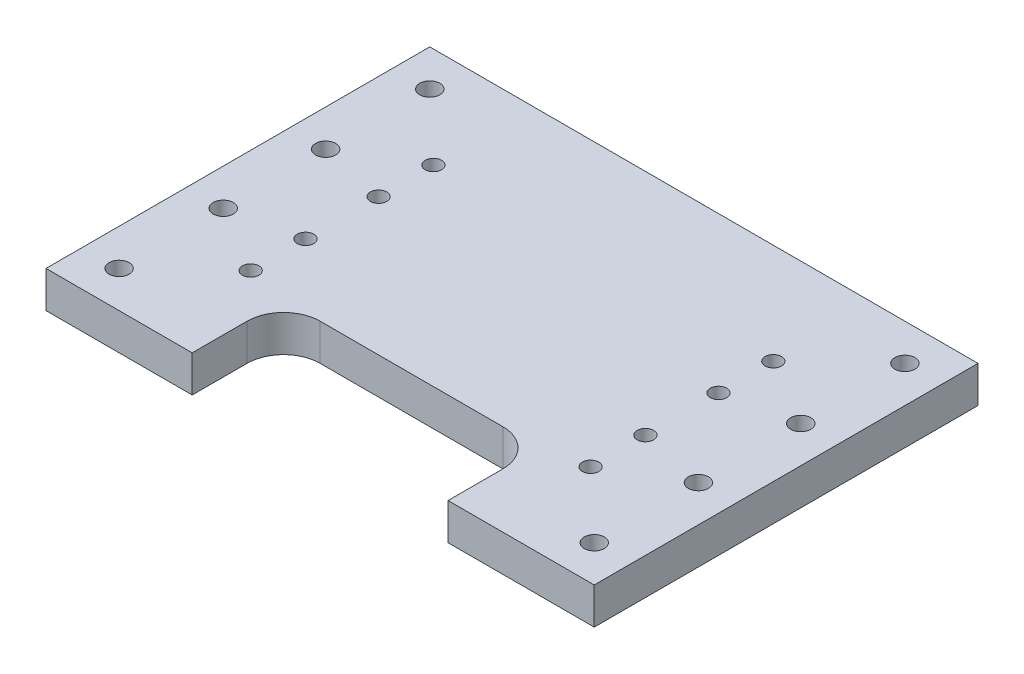
ISO-10303-21;
HEADER;
FILE_DESCRIPTION(('STEP AP214'),'2;1');
FILE_NAME('part.step','',(''),(''),'','','');
FILE_SCHEMA(('AUTOMOTIVE_DESIGN { 1 0 10303 214 1 1 1 1 }'));
ENDSEC;
DATA;
#1=APPLICATION_CONTEXT('core data for automotive mechanical design processes');
#2=APPLICATION_PROTOCOL_DEFINITION('international standard','automotive_design',2000,#1);
#3=PRODUCT_CONTEXT('',#1,'mechanical');
#4=PRODUCT('Part','Part','',(#3));
#5=PRODUCT_RELATED_PRODUCT_CATEGORY('part','',(#4));
#6=PRODUCT_DEFINITION_FORMATION('','',#4);
#7=PRODUCT_DEFINITION_CONTEXT('part definition',#1,'design');
#8=PRODUCT_DEFINITION('design','',#6,#7);
#9=PRODUCT_DEFINITION_SHAPE('','',#8);
#10=(LENGTH_UNIT() NAMED_UNIT(*) SI_UNIT(.MILLI.,.METRE.));
#11=(NAMED_UNIT(*) PLANE_ANGLE_UNIT() SI_UNIT($,.RADIAN.));
#12=(NAMED_UNIT(*) SI_UNIT($,.STERADIAN.) SOLID_ANGLE_UNIT());
#13=UNCERTAINTY_MEASURE_WITH_UNIT(LENGTH_MEASURE(1.E-05),#10,'distance_accuracy_value','');
#14=(GEOMETRIC_REPRESENTATION_CONTEXT(3) GLOBAL_UNCERTAINTY_ASSIGNED_CONTEXT((#13)) GLOBAL_UNIT_ASSIGNED_CONTEXT((#10,
#11,#12)) REPRESENTATION_CONTEXT('',''));
#15=CARTESIAN_POINT('',(0.,0.,0.));
#16=DIRECTION('',(0.,0.,1.));
#17=DIRECTION('',(1.,0.,0.));
#18=AXIS2_PLACEMENT_3D('',#15,#16,#17);
#19=CARTESIAN_POINT('',(75.,5.,52.5));
#20=DIRECTION('',(0.,0.,-1.));
#21=DIRECTION('',(-1.,0.,0.));
#22=AXIS2_PLACEMENT_3D('',#19,#20,#21);
#23=PLANE('',#22);
#24=DIRECTION('',(1.,0.,0.));
#25=VECTOR('',#24,1.);
#26=CARTESIAN_POINT('',(75.,-5.,52.5));
#27=LINE('',#26,#25);
#28=CARTESIAN_POINT('',(-75.,-5.,52.5));
#29=VERTEX_POINT('',#28);
#30=CARTESIAN_POINT('',(-35.,-5.,52.5));
#31=VERTEX_POINT('',#30);
#32=EDGE_CURVE('E142',#29,#31,#27,.T.);
#33=ORIENTED_EDGE('',*,*,#32,.T.);
#34=DIRECTION('',(0.,1.,0.));
#35=VECTOR('',#34,1.);
#36=CARTESIAN_POINT('',(-35.,-5.,52.5));
#37=LINE('',#36,#35);
#38=CARTESIAN_POINT('',(-35.,5.,52.5));
#39=VERTEX_POINT('',#38);
#40=EDGE_CURVE('E153',#31,#39,#37,.T.);
#41=ORIENTED_EDGE('',*,*,#40,.T.);
#42=DIRECTION('',(1.,0.,0.));
#43=VECTOR('',#42,1.);
#44=CARTESIAN_POINT('',(75.,5.,52.5));
#45=LINE('',#44,#43);
#46=CARTESIAN_POINT('',(-75.,5.,52.5));
#47=VERTEX_POINT('',#46);
#48=EDGE_CURVE('E184',#47,#39,#45,.T.);
#49=ORIENTED_EDGE('',*,*,#48,.F.);
#50=DIRECTION('',(0.,-1.,0.));
#51=VECTOR('',#50,1.);
#52=CARTESIAN_POINT('',(-75.,5.,52.5));
#53=LINE('',#52,#51);
#54=EDGE_CURVE('E166',#47,#29,#53,.T.);
#55=ORIENTED_EDGE('',*,*,#54,.T.);
#56=EDGE_LOOP('',(#33,#41,#49,#55));
#57=FACE_BOUND('',#56,.T.);
#58=ADVANCED_FACE('F45',(#57),#23,.F.);
#59=CARTESIAN_POINT('',(75.,5.,-52.5));
#60=DIRECTION('',(-1.,0.,0.));
#61=DIRECTION('',(0.,0.,1.));
#62=AXIS2_PLACEMENT_3D('',#59,#60,#61);
#63=PLANE('',#62);
#64=DIRECTION('',(0.,0.,-1.));
#65=VECTOR('',#64,1.);
#66=CARTESIAN_POINT('',(75.,-5.,-52.5));
#67=LINE('',#66,#65);
#68=CARTESIAN_POINT('',(75.,-5.,52.5));
#69=VERTEX_POINT('',#68);
#70=CARTESIAN_POINT('',(75.,-5.,-52.5));
#71=VERTEX_POINT('',#70);
#72=EDGE_CURVE('E217',#69,#71,#67,.T.);
#73=ORIENTED_EDGE('',*,*,#72,.T.);
#74=DIRECTION('',(0.,-1.,0.));
#75=VECTOR('',#74,1.);
#76=CARTESIAN_POINT('',(75.,5.,-52.5));
#77=LINE('',#76,#75);
#78=CARTESIAN_POINT('',(75.,5.,-52.5));
#79=VERTEX_POINT('',#78);
#80=EDGE_CURVE('E189',#79,#71,#77,.T.);
#81=ORIENTED_EDGE('',*,*,#80,.F.);
#82=DIRECTION('',(0.,0.,-1.));
#83=VECTOR('',#82,1.);
#84=CARTESIAN_POINT('',(75.,5.,-52.5));
#85=LINE('',#84,#83);
#86=CARTESIAN_POINT('',(75.,5.,52.5));
#87=VERTEX_POINT('',#86);
#88=EDGE_CURVE('E168',#87,#79,#85,.T.);
#89=ORIENTED_EDGE('',*,*,#88,.F.);
#90=DIRECTION('',(0.,-1.,0.));
#91=VECTOR('',#90,1.);
#92=CARTESIAN_POINT('',(75.,5.,52.5));
#93=LINE('',#92,#91);
#94=EDGE_CURVE('E180',#87,#69,#93,.T.);
#95=ORIENTED_EDGE('',*,*,#94,.T.);
#96=EDGE_LOOP('',(#73,#81,#89,#95));
#97=FACE_BOUND('',#96,.T.);
#98=ADVANCED_FACE('F413',(#97),#63,.F.);
#99=CARTESIAN_POINT('',(75.,5.,-52.5));
#100=DIRECTION('',(0.,0.,1.));
#101=DIRECTION('',(1.,0.,0.));
#102=AXIS2_PLACEMENT_3D('',#99,#100,#101);
#103=PLANE('',#102);
#104=DIRECTION('',(-1.,0.,0.));
#105=VECTOR('',#104,1.);
#106=CARTESIAN_POINT('',(75.,-5.,-52.5));
#107=LINE('',#106,#105);
#108=CARTESIAN_POINT('',(-75.,-5.,-52.5));
#109=VERTEX_POINT('',#108);
#110=EDGE_CURVE('E219',#71,#109,#107,.T.);
#111=ORIENTED_EDGE('',*,*,#110,.T.);
#112=DIRECTION('',(0.,-1.,0.));
#113=VECTOR('',#112,1.);
#114=CARTESIAN_POINT('',(-75.,5.,-52.5));
#115=LINE('',#114,#113);
#116=CARTESIAN_POINT('',(-75.,5.,-52.5));
#117=VERTEX_POINT('',#116);
#118=EDGE_CURVE('E186',#117,#109,#115,.T.);
#119=ORIENTED_EDGE('',*,*,#118,.F.);
#120=DIRECTION('',(-1.,0.,0.));
#121=VECTOR('',#120,1.);
#122=CARTESIAN_POINT('',(75.,5.,-52.5));
#123=LINE('',#122,#121);
#124=EDGE_CURVE('E173',#79,#117,#123,.T.);
#125=ORIENTED_EDGE('',*,*,#124,.F.);
#126=ORIENTED_EDGE('',*,*,#80,.T.);
#127=EDGE_LOOP('',(#111,#119,#125,#126));
#128=FACE_BOUND('',#127,.T.);
#129=ADVANCED_FACE('F421',(#128),#103,.F.);
#130=CARTESIAN_POINT('',(-75.,5.,-52.5));
#131=DIRECTION('',(1.,0.,0.));
#132=DIRECTION('',(0.,0.,-1.));
#133=AXIS2_PLACEMENT_3D('',#130,#131,#132);
#134=PLANE('',#133);
#135=DIRECTION('',(0.,0.,1.));
#136=VECTOR('',#135,1.);
#137=CARTESIAN_POINT('',(-75.,-5.,-52.5));
#138=LINE('',#137,#136);
#139=EDGE_CURVE('E176',#109,#29,#138,.T.);
#140=ORIENTED_EDGE('',*,*,#139,.T.);
#141=ORIENTED_EDGE('',*,*,#54,.F.);
#142=DIRECTION('',(0.,0.,1.));
#143=VECTOR('',#142,1.);
#144=CARTESIAN_POINT('',(-75.,5.,-52.5));
#145=LINE('',#144,#143);
#146=EDGE_CURVE('E258',#117,#47,#145,.T.);
#147=ORIENTED_EDGE('',*,*,#146,.F.);
#148=ORIENTED_EDGE('',*,*,#118,.T.);
#149=EDGE_LOOP('',(#140,#141,#147,#148));
#150=FACE_BOUND('',#149,.T.);
#151=ADVANCED_FACE('F425',(#150),#134,.F.);
#152=CARTESIAN_POINT('',(35.,5.,52.5));
#153=VERTEX_POINT('',#152);
#154=EDGE_CURVE('E257',#153,#87,#45,.T.);
#155=ORIENTED_EDGE('',*,*,#154,.F.);
#156=DIRECTION('',(0.,1.,0.));
#157=VECTOR('',#156,1.);
#158=CARTESIAN_POINT('',(35.,-5.,52.5));
#159=LINE('',#158,#157);
#160=CARTESIAN_POINT('',(35.,-5.,52.5));
#161=VERTEX_POINT('',#160);
#162=EDGE_CURVE('E161',#161,#153,#159,.T.);
#163=ORIENTED_EDGE('',*,*,#162,.F.);
#164=EDGE_CURVE('E169',#161,#69,#27,.T.);
#165=ORIENTED_EDGE('',*,*,#164,.T.);
#166=ORIENTED_EDGE('',*,*,#94,.F.);
#167=EDGE_LOOP('',(#155,#163,#165,#166));
#168=FACE_BOUND('',#167,.T.);
#169=ADVANCED_FACE('F415',(#168),#23,.F.);
#170=CARTESIAN_POINT('',(0.,5.,0.));
#171=DIRECTION('',(0.,-1.,0.));
#172=DIRECTION('',(0.,0.,-1.));
#173=AXIS2_PLACEMENT_3D('',#170,#171,#172);
#174=PLANE('',#173);
#175=CARTESIAN_POINT('',(65.0000000000001,5.,42.5));
#176=DIRECTION('',(0.,1.,0.));
#177=DIRECTION('',(0.,0.,1.));
#178=AXIS2_PLACEMENT_3D('',#175,#176,#177);
#179=CIRCLE('',#178,2.75);
#180=CARTESIAN_POINT('',(65.0000000000001,5.,45.25));
#181=VERTEX_POINT('',#180);
#182=EDGE_CURVE('E375',#181,#181,#179,.T.);
#183=ORIENTED_EDGE('',*,*,#182,.F.);
#184=EDGE_LOOP('',(#183));
#185=FACE_BOUND('',#184,.T.);
#186=CARTESIAN_POINT('',(65.,5.,-42.5));
#187=DIRECTION('',(0.,1.,0.));
#188=DIRECTION('',(0.,0.,1.));
#189=AXIS2_PLACEMENT_3D('',#186,#187,#188);
#190=CIRCLE('',#189,2.75);
#191=CARTESIAN_POINT('',(65.,5.,-39.75));
#192=VERTEX_POINT('',#191);
#193=EDGE_CURVE('E368',#192,#192,#190,.T.);
#194=ORIENTED_EDGE('',*,*,#193,.F.);
#195=EDGE_LOOP('',(#194));
#196=FACE_BOUND('',#195,.T.);
#197=CARTESIAN_POINT('',(-65.,5.,-42.5));
#198=DIRECTION('',(0.,1.,0.));
#199=DIRECTION('',(0.,0.,1.));
#200=AXIS2_PLACEMENT_3D('',#197,#198,#199);
#201=CIRCLE('',#200,2.75);
#202=CARTESIAN_POINT('',(-65.,5.,-39.75));
#203=VERTEX_POINT('',#202);
#204=EDGE_CURVE('E362',#203,#203,#201,.T.);
#205=ORIENTED_EDGE('',*,*,#204,.F.);
#206=EDGE_LOOP('',(#205));
#207=FACE_BOUND('',#206,.T.);
#208=CARTESIAN_POINT('',(-65.,5.,42.5));
#209=DIRECTION('',(0.,1.,0.));
#210=DIRECTION('',(0.,0.,1.));
#211=AXIS2_PLACEMENT_3D('',#208,#209,#210);
#212=CIRCLE('',#211,2.75);
#213=CARTESIAN_POINT('',(-65.,5.,45.25));
#214=VERTEX_POINT('',#213);
#215=EDGE_CURVE('E356',#214,#214,#212,.T.);
#216=ORIENTED_EDGE('',*,*,#215,.F.);
#217=EDGE_LOOP('',(#216));
#218=FACE_BOUND('',#217,.T.);
#219=CARTESIAN_POINT('',(-65.,5.,14.));
#220=DIRECTION('',(0.,1.,0.));
#221=DIRECTION('',(0.,0.,1.));
#222=AXIS2_PLACEMENT_3D('',#219,#220,#221);
#223=CIRCLE('',#222,2.75);
#224=CARTESIAN_POINT('',(-65.,5.,16.75));
#225=VERTEX_POINT('',#224);
#226=EDGE_CURVE('E350',#225,#225,#223,.T.);
#227=ORIENTED_EDGE('',*,*,#226,.F.);
#228=EDGE_LOOP('',(#227));
#229=FACE_BOUND('',#228,.T.);
#230=CARTESIAN_POINT('',(65.,5.,14.));
#231=DIRECTION('',(0.,1.,0.));
#232=DIRECTION('',(0.,0.,1.));
#233=AXIS2_PLACEMENT_3D('',#230,#231,#232);
#234=CIRCLE('',#233,2.75);
#235=CARTESIAN_POINT('',(65.,5.,16.75));
#236=VERTEX_POINT('',#235);
#237=EDGE_CURVE('E240',#236,#236,#234,.T.);
#238=ORIENTED_EDGE('',*,*,#237,.F.);
#239=EDGE_LOOP('',(#238));
#240=FACE_BOUND('',#239,.T.);
#241=CARTESIAN_POINT('',(-65.,5.,-14.));
#242=DIRECTION('',(0.,1.,0.));
#243=DIRECTION('',(0.,0.,1.));
#244=AXIS2_PLACEMENT_3D('',#241,#242,#243);
#245=CIRCLE('',#244,2.75);
#246=CARTESIAN_POINT('',(-65.,5.,-11.25));
#247=VERTEX_POINT('',#246);
#248=EDGE_CURVE('E343',#247,#247,#245,.T.);
#249=ORIENTED_EDGE('',*,*,#248,.F.);
#250=EDGE_LOOP('',(#249));
#251=FACE_BOUND('',#250,.T.);
#252=CARTESIAN_POINT('',(65.,5.,-14.));
#253=DIRECTION('',(0.,1.,0.));
#254=DIRECTION('',(0.,0.,1.));
#255=AXIS2_PLACEMENT_3D('',#252,#253,#254);
#256=CIRCLE('',#255,2.75);
#257=CARTESIAN_POINT('',(65.,5.,-11.25));
#258=VERTEX_POINT('',#257);
#259=EDGE_CURVE('E337',#258,#258,#256,.T.);
#260=ORIENTED_EDGE('',*,*,#259,.F.);
#261=EDGE_LOOP('',(#260));
#262=FACE_BOUND('',#261,.T.);
#263=CARTESIAN_POINT('',(46.5,4.99999999999999,25.));
#264=DIRECTION('',(0.,-1.,0.));
#265=DIRECTION('',(0.,0.,-1.));
#266=AXIS2_PLACEMENT_3D('',#263,#264,#265);
#267=CIRCLE('',#266,2.25000000000001);
#268=CARTESIAN_POINT('',(46.5,4.99999999999999,22.75));
#269=VERTEX_POINT('',#268);
#270=EDGE_CURVE('E211',#269,#269,#267,.T.);
#271=ORIENTED_EDGE('',*,*,#270,.T.);
#272=EDGE_LOOP('',(#271));
#273=FACE_BOUND('',#272,.T.);
#274=CARTESIAN_POINT('',(46.5,4.99999999999999,9.99999999999999));
#275=DIRECTION('',(0.,-1.,0.));
#276=DIRECTION('',(0.,0.,-1.));
#277=AXIS2_PLACEMENT_3D('',#274,#275,#276);
#278=CIRCLE('',#277,2.25000000000001);
#279=CARTESIAN_POINT('',(46.5,4.99999999999999,7.74999999999999));
#280=VERTEX_POINT('',#279);
#281=EDGE_CURVE('E246',#280,#280,#278,.T.);
#282=ORIENTED_EDGE('',*,*,#281,.T.);
#283=EDGE_LOOP('',(#282));
#284=FACE_BOUND('',#283,.T.);
#285=CARTESIAN_POINT('',(46.5,4.99999999999999,-10.));
#286=DIRECTION('',(0.,-1.,0.));
#287=DIRECTION('',(0.,0.,-1.));
#288=AXIS2_PLACEMENT_3D('',#285,#286,#287);
#289=CIRCLE('',#288,2.25000000000001);
#290=CARTESIAN_POINT('',(46.5,4.99999999999999,-12.25));
#291=VERTEX_POINT('',#290);
#292=EDGE_CURVE('E320',#291,#291,#289,.T.);
#293=ORIENTED_EDGE('',*,*,#292,.T.);
#294=EDGE_LOOP('',(#293));
#295=FACE_BOUND('',#294,.T.);
#296=CARTESIAN_POINT('',(46.5,4.99999999999999,-25.));
#297=DIRECTION('',(0.,-1.,0.));
#298=DIRECTION('',(0.,0.,-1.));
#299=AXIS2_PLACEMENT_3D('',#296,#297,#298);
#300=CIRCLE('',#299,2.25000000000001);
#301=CARTESIAN_POINT('',(46.5,4.99999999999999,-27.25));
#302=VERTEX_POINT('',#301);
#303=EDGE_CURVE('E308',#302,#302,#300,.T.);
#304=ORIENTED_EDGE('',*,*,#303,.T.);
#305=EDGE_LOOP('',(#304));
#306=FACE_BOUND('',#305,.T.);
#307=CARTESIAN_POINT('',(-46.5,4.99999999999999,25.));
#308=DIRECTION('',(0.,-1.,0.));
#309=DIRECTION('',(0.,0.,-1.));
#310=AXIS2_PLACEMENT_3D('',#307,#308,#309);
#311=CIRCLE('',#310,2.25000000000001);
#312=CARTESIAN_POINT('',(-46.5,4.99999999999999,22.75));
#313=VERTEX_POINT('',#312);
#314=EDGE_CURVE('E296',#313,#313,#311,.T.);
#315=ORIENTED_EDGE('',*,*,#314,.T.);
#316=EDGE_LOOP('',(#315));
#317=FACE_BOUND('',#316,.T.);
#318=CARTESIAN_POINT('',(-46.5,4.99999999999999,9.99999999999999));
#319=DIRECTION('',(0.,-1.,0.));
#320=DIRECTION('',(0.,0.,-1.));
#321=AXIS2_PLACEMENT_3D('',#318,#319,#320);
#322=CIRCLE('',#321,2.25000000000001);
#323=CARTESIAN_POINT('',(-46.5,4.99999999999999,7.74999999999999));
#324=VERTEX_POINT('',#323);
#325=EDGE_CURVE('E284',#324,#324,#322,.T.);
#326=ORIENTED_EDGE('',*,*,#325,.T.);
#327=EDGE_LOOP('',(#326));
#328=FACE_BOUND('',#327,.T.);
#329=CARTESIAN_POINT('',(-46.5,4.99999999999999,-10.));
#330=DIRECTION('',(0.,-1.,0.));
#331=DIRECTION('',(0.,0.,-1.));
#332=AXIS2_PLACEMENT_3D('',#329,#330,#331);
#333=CIRCLE('',#332,2.25000000000001);
#334=CARTESIAN_POINT('',(-46.5,4.99999999999999,-12.25));
#335=VERTEX_POINT('',#334);
#336=EDGE_CURVE('E272',#335,#335,#333,.T.);
#337=ORIENTED_EDGE('',*,*,#336,.T.);
#338=EDGE_LOOP('',(#337));
#339=FACE_BOUND('',#338,.T.);
#340=CARTESIAN_POINT('',(-46.5,4.99999999999999,-25.));
#341=DIRECTION('',(0.,-1.,0.));
#342=DIRECTION('',(0.,0.,-1.));
#343=AXIS2_PLACEMENT_3D('',#340,#341,#342);
#344=CIRCLE('',#343,2.25000000000001);
#345=CARTESIAN_POINT('',(-46.5,4.99999999999999,-27.25));
#346=VERTEX_POINT('',#345);
#347=EDGE_CURVE('E220',#346,#346,#344,.T.);
#348=ORIENTED_EDGE('',*,*,#347,.T.);
#349=EDGE_LOOP('',(#348));
#350=FACE_BOUND('',#349,.T.);
#351=ORIENTED_EDGE('',*,*,#48,.T.);
#352=DIRECTION('',(0.,0.,1.));
#353=VECTOR('',#352,1.);
#354=CARTESIAN_POINT('',(-35.,5.,52.5));
#355=LINE('',#354,#353);
#356=CARTESIAN_POINT('',(-35.,5.,37.5));
#357=VERTEX_POINT('',#356);
#358=EDGE_CURVE('E156',#357,#39,#355,.T.);
#359=ORIENTED_EDGE('',*,*,#358,.F.);
#360=CARTESIAN_POINT('',(-25.,5.,37.5));
#361=DIRECTION('',(0.,-1.,0.));
#362=DIRECTION('',(0.,0.,-1.));
#363=AXIS2_PLACEMENT_3D('',#360,#361,#362);
#364=CIRCLE('',#363,10.);
#365=CARTESIAN_POINT('',(-25.,5.,27.5));
#366=VERTEX_POINT('',#365);
#367=EDGE_CURVE('E204',#357,#366,#364,.T.);
#368=ORIENTED_EDGE('',*,*,#367,.T.);
#369=DIRECTION('',(-1.,0.,0.));
#370=VECTOR('',#369,1.);
#371=CARTESIAN_POINT('',(-35.,5.,27.5));
#372=LINE('',#371,#370);
#373=CARTESIAN_POINT('',(25.,5.,27.5));
#374=VERTEX_POINT('',#373);
#375=EDGE_CURVE('E150',#374,#366,#372,.T.);
#376=ORIENTED_EDGE('',*,*,#375,.F.);
#377=CARTESIAN_POINT('',(25.,5.,37.5));
#378=DIRECTION('',(0.,-1.,0.));
#379=DIRECTION('',(0.,0.,-1.));
#380=AXIS2_PLACEMENT_3D('',#377,#378,#379);
#381=CIRCLE('',#380,10.);
#382=CARTESIAN_POINT('',(35.,5.,37.5));
#383=VERTEX_POINT('',#382);
#384=EDGE_CURVE('E54',#374,#383,#381,.T.);
#385=ORIENTED_EDGE('',*,*,#384,.T.);
#386=DIRECTION('',(0.,0.,-1.));
#387=VECTOR('',#386,1.);
#388=CARTESIAN_POINT('',(35.,5.,52.5));
#389=LINE('',#388,#387);
#390=EDGE_CURVE('E383',#153,#383,#389,.T.);
#391=ORIENTED_EDGE('',*,*,#390,.F.);
#392=ORIENTED_EDGE('',*,*,#154,.T.);
#393=ORIENTED_EDGE('',*,*,#88,.T.);
#394=ORIENTED_EDGE('',*,*,#124,.T.);
#395=ORIENTED_EDGE('',*,*,#146,.T.);
#396=EDGE_LOOP('',(#351,#359,#368,#376,#385,#391,#392,#393,#394,#395));
#397=FACE_BOUND('',#396,.T.);
#398=ADVANCED_FACE('F401',(#185,#196,#207,#218,#229,#240,#251,#262,#273,#284,#295,#306,#317,
#328,#339,#350,#397),#174,.F.);
#399=CARTESIAN_POINT('',(0.,-5.,0.));
#400=DIRECTION('',(0.,-1.,0.));
#401=DIRECTION('',(0.,0.,-1.));
#402=AXIS2_PLACEMENT_3D('',#399,#400,#401);
#403=PLANE('',#402);
#404=DIRECTION('',(-1.,0.,0.));
#405=VECTOR('',#404,1.);
#406=CARTESIAN_POINT('',(-35.,-5.,27.5));
#407=LINE('',#406,#405);
#408=CARTESIAN_POINT('',(25.,-5.,27.5));
#409=VERTEX_POINT('',#408);
#410=CARTESIAN_POINT('',(-25.,-5.,27.5));
#411=VERTEX_POINT('',#410);
#412=EDGE_CURVE('E162',#409,#411,#407,.T.);
#413=ORIENTED_EDGE('',*,*,#412,.T.);
#414=CARTESIAN_POINT('',(-25.,-5.,37.5));
#415=DIRECTION('',(0.,-1.,0.));
#416=DIRECTION('',(0.,0.,-1.));
#417=AXIS2_PLACEMENT_3D('',#414,#415,#416);
#418=CIRCLE('',#417,10.);
#419=CARTESIAN_POINT('',(-35.,-5.,37.5));
#420=VERTEX_POINT('',#419);
#421=EDGE_CURVE('E144',#411,#420,#418,.F.);
#422=ORIENTED_EDGE('',*,*,#421,.T.);
#423=DIRECTION('',(0.,0.,1.));
#424=VECTOR('',#423,1.);
#425=CARTESIAN_POINT('',(-35.,-5.,52.5));
#426=LINE('',#425,#424);
#427=EDGE_CURVE('E135',#420,#31,#426,.T.);
#428=ORIENTED_EDGE('',*,*,#427,.T.);
#429=ORIENTED_EDGE('',*,*,#32,.F.);
#430=ORIENTED_EDGE('',*,*,#139,.F.);
#431=ORIENTED_EDGE('',*,*,#110,.F.);
#432=ORIENTED_EDGE('',*,*,#72,.F.);
#433=ORIENTED_EDGE('',*,*,#164,.F.);
#434=DIRECTION('',(0.,0.,-1.));
#435=VECTOR('',#434,1.);
#436=CARTESIAN_POINT('',(35.,-5.,52.5));
#437=LINE('',#436,#435);
#438=CARTESIAN_POINT('',(35.,-5.,37.5));
#439=VERTEX_POINT('',#438);
#440=EDGE_CURVE('E149',#161,#439,#437,.T.);
#441=ORIENTED_EDGE('',*,*,#440,.T.);
#442=CARTESIAN_POINT('',(25.,-5.,37.5));
#443=DIRECTION('',(0.,-1.,0.));
#444=DIRECTION('',(0.,0.,-1.));
#445=AXIS2_PLACEMENT_3D('',#442,#443,#444);
#446=CIRCLE('',#445,10.);
#447=EDGE_CURVE('E11',#439,#409,#446,.F.);
#448=ORIENTED_EDGE('',*,*,#447,.T.);
#449=EDGE_LOOP('',(#413,#422,#428,#429,#430,#431,#432,#433,#441,#448));
#450=FACE_BOUND('',#449,.T.);
#451=CARTESIAN_POINT('',(65.0000000000001,-5.,42.5));
#452=DIRECTION('',(0.,1.,0.));
#453=DIRECTION('',(0.,0.,1.));
#454=AXIS2_PLACEMENT_3D('',#451,#452,#453);
#455=CIRCLE('',#454,2.75);
#456=CARTESIAN_POINT('',(65.0000000000001,-5.,45.25));
#457=VERTEX_POINT('',#456);
#458=EDGE_CURVE('E371',#457,#457,#455,.T.);
#459=ORIENTED_EDGE('',*,*,#458,.T.);
#460=EDGE_LOOP('',(#459));
#461=FACE_BOUND('',#460,.T.);
#462=CARTESIAN_POINT('',(65.,-5.,-42.5));
#463=DIRECTION('',(0.,1.,0.));
#464=DIRECTION('',(0.,0.,1.));
#465=AXIS2_PLACEMENT_3D('',#462,#463,#464);
#466=CIRCLE('',#465,2.75);
#467=CARTESIAN_POINT('',(65.,-5.,-39.75));
#468=VERTEX_POINT('',#467);
#469=EDGE_CURVE('E365',#468,#468,#466,.T.);
#470=ORIENTED_EDGE('',*,*,#469,.T.);
#471=EDGE_LOOP('',(#470));
#472=FACE_BOUND('',#471,.T.);
#473=CARTESIAN_POINT('',(-65.,-5.,-42.5));
#474=DIRECTION('',(0.,1.,0.));
#475=DIRECTION('',(0.,0.,1.));
#476=AXIS2_PLACEMENT_3D('',#473,#474,#475);
#477=CIRCLE('',#476,2.75);
#478=CARTESIAN_POINT('',(-65.,-5.,-39.75));
#479=VERTEX_POINT('',#478);
#480=EDGE_CURVE('E359',#479,#479,#477,.T.);
#481=ORIENTED_EDGE('',*,*,#480,.T.);
#482=EDGE_LOOP('',(#481));
#483=FACE_BOUND('',#482,.T.);
#484=CARTESIAN_POINT('',(-65.,-5.,42.5));
#485=DIRECTION('',(0.,1.,0.));
#486=DIRECTION('',(0.,0.,1.));
#487=AXIS2_PLACEMENT_3D('',#484,#485,#486);
#488=CIRCLE('',#487,2.75);
#489=CARTESIAN_POINT('',(-65.,-5.,45.25));
#490=VERTEX_POINT('',#489);
#491=EDGE_CURVE('E353',#490,#490,#488,.T.);
#492=ORIENTED_EDGE('',*,*,#491,.T.);
#493=EDGE_LOOP('',(#492));
#494=FACE_BOUND('',#493,.T.);
#495=CARTESIAN_POINT('',(-65.,-5.,14.));
#496=DIRECTION('',(0.,1.,0.));
#497=DIRECTION('',(0.,0.,1.));
#498=AXIS2_PLACEMENT_3D('',#495,#496,#497);
#499=CIRCLE('',#498,2.75);
#500=CARTESIAN_POINT('',(-65.,-5.,16.75));
#501=VERTEX_POINT('',#500);
#502=EDGE_CURVE('E244',#501,#501,#499,.T.);
#503=ORIENTED_EDGE('',*,*,#502,.T.);
#504=EDGE_LOOP('',(#503));
#505=FACE_BOUND('',#504,.T.);
#506=CARTESIAN_POINT('',(65.,-5.,14.));
#507=DIRECTION('',(0.,1.,0.));
#508=DIRECTION('',(0.,0.,1.));
#509=AXIS2_PLACEMENT_3D('',#506,#507,#508);
#510=CIRCLE('',#509,2.75);
#511=CARTESIAN_POINT('',(65.,-5.,16.75));
#512=VERTEX_POINT('',#511);
#513=EDGE_CURVE('E243',#512,#512,#510,.T.);
#514=ORIENTED_EDGE('',*,*,#513,.T.);
#515=EDGE_LOOP('',(#514));
#516=FACE_BOUND('',#515,.T.);
#517=CARTESIAN_POINT('',(-65.,-5.,-14.));
#518=DIRECTION('',(0.,1.,0.));
#519=DIRECTION('',(0.,0.,1.));
#520=AXIS2_PLACEMENT_3D('',#517,#518,#519);
#521=CIRCLE('',#520,2.75);
#522=CARTESIAN_POINT('',(-65.,-5.,-11.25));
#523=VERTEX_POINT('',#522);
#524=EDGE_CURVE('E340',#523,#523,#521,.T.);
#525=ORIENTED_EDGE('',*,*,#524,.T.);
#526=EDGE_LOOP('',(#525));
#527=FACE_BOUND('',#526,.T.);
#528=CARTESIAN_POINT('',(65.,-5.,-14.));
#529=DIRECTION('',(0.,1.,0.));
#530=DIRECTION('',(0.,0.,1.));
#531=AXIS2_PLACEMENT_3D('',#528,#529,#530);
#532=CIRCLE('',#531,2.75);
#533=CARTESIAN_POINT('',(65.,-5.,-11.25));
#534=VERTEX_POINT('',#533);
#535=EDGE_CURVE('E227',#534,#534,#532,.T.);
#536=ORIENTED_EDGE('',*,*,#535,.T.);
#537=EDGE_LOOP('',(#536));
#538=FACE_BOUND('',#537,.T.);
#539=CARTESIAN_POINT('',(46.5,-5.,25.));
#540=DIRECTION('',(0.,-1.,0.));
#541=DIRECTION('',(0.,0.,-1.));
#542=AXIS2_PLACEMENT_3D('',#539,#540,#541);
#543=CIRCLE('',#542,4.);
#544=CARTESIAN_POINT('',(46.5,-5.,21.));
#545=VERTEX_POINT('',#544);
#546=EDGE_CURVE('E223',#545,#545,#543,.T.);
#547=ORIENTED_EDGE('',*,*,#546,.F.);
#548=EDGE_LOOP('',(#547));
#549=FACE_BOUND('',#548,.T.);
#550=CARTESIAN_POINT('',(46.5,-5.,9.99999999999999));
#551=DIRECTION('',(0.,-1.,0.));
#552=DIRECTION('',(0.,0.,-1.));
#553=AXIS2_PLACEMENT_3D('',#550,#551,#552);
#554=CIRCLE('',#553,4.);
#555=CARTESIAN_POINT('',(46.5,-5.,6.));
#556=VERTEX_POINT('',#555);
#557=EDGE_CURVE('E214',#556,#556,#554,.T.);
#558=ORIENTED_EDGE('',*,*,#557,.F.);
#559=EDGE_LOOP('',(#558));
#560=FACE_BOUND('',#559,.T.);
#561=CARTESIAN_POINT('',(46.5,-5.,-10.));
#562=DIRECTION('',(0.,-1.,0.));
#563=DIRECTION('',(0.,0.,-1.));
#564=AXIS2_PLACEMENT_3D('',#561,#562,#563);
#565=CIRCLE('',#564,4.);
#566=CARTESIAN_POINT('',(46.5,-5.,-14.));
#567=VERTEX_POINT('',#566);
#568=EDGE_CURVE('E249',#567,#567,#565,.T.);
#569=ORIENTED_EDGE('',*,*,#568,.F.);
#570=EDGE_LOOP('',(#569));
#571=FACE_BOUND('',#570,.T.);
#572=CARTESIAN_POINT('',(46.5,-5.,-25.));
#573=DIRECTION('',(0.,-1.,0.));
#574=DIRECTION('',(0.,0.,-1.));
#575=AXIS2_PLACEMENT_3D('',#572,#573,#574);
#576=CIRCLE('',#575,4.);
#577=CARTESIAN_POINT('',(46.5,-5.,-29.));
#578=VERTEX_POINT('',#577);
#579=EDGE_CURVE('E317',#578,#578,#576,.T.);
#580=ORIENTED_EDGE('',*,*,#579,.F.);
#581=EDGE_LOOP('',(#580));
#582=FACE_BOUND('',#581,.T.);
#583=CARTESIAN_POINT('',(-46.5,-5.,25.));
#584=DIRECTION('',(0.,-1.,0.));
#585=DIRECTION('',(0.,0.,-1.));
#586=AXIS2_PLACEMENT_3D('',#583,#584,#585);
#587=CIRCLE('',#586,4.);
#588=CARTESIAN_POINT('',(-46.5,-5.,21.));
#589=VERTEX_POINT('',#588);
#590=EDGE_CURVE('E305',#589,#589,#587,.T.);
#591=ORIENTED_EDGE('',*,*,#590,.F.);
#592=EDGE_LOOP('',(#591));
#593=FACE_BOUND('',#592,.T.);
#594=CARTESIAN_POINT('',(-46.5,-5.,9.99999999999999));
#595=DIRECTION('',(0.,-1.,0.));
#596=DIRECTION('',(0.,0.,-1.));
#597=AXIS2_PLACEMENT_3D('',#594,#595,#596);
#598=CIRCLE('',#597,4.);
#599=CARTESIAN_POINT('',(-46.5,-5.,6.));
#600=VERTEX_POINT('',#599);
#601=EDGE_CURVE('E293',#600,#600,#598,.T.);
#602=ORIENTED_EDGE('',*,*,#601,.F.);
#603=EDGE_LOOP('',(#602));
#604=FACE_BOUND('',#603,.T.);
#605=CARTESIAN_POINT('',(-46.5,-5.,-10.));
#606=DIRECTION('',(0.,-1.,0.));
#607=DIRECTION('',(0.,0.,-1.));
#608=AXIS2_PLACEMENT_3D('',#605,#606,#607);
#609=CIRCLE('',#608,3.99999999999999);
#610=CARTESIAN_POINT('',(-46.5,-5.,-14.));
#611=VERTEX_POINT('',#610);
#612=EDGE_CURVE('E281',#611,#611,#609,.T.);
#613=ORIENTED_EDGE('',*,*,#612,.F.);
#614=EDGE_LOOP('',(#613));
#615=FACE_BOUND('',#614,.T.);
#616=CARTESIAN_POINT('',(-46.5,-5.,-25.));
#617=DIRECTION('',(0.,-1.,0.));
#618=DIRECTION('',(0.,0.,-1.));
#619=AXIS2_PLACEMENT_3D('',#616,#617,#618);
#620=CIRCLE('',#619,4.);
#621=CARTESIAN_POINT('',(-46.5,-5.,-29.));
#622=VERTEX_POINT('',#621);
#623=EDGE_CURVE('E269',#622,#622,#620,.T.);
#624=ORIENTED_EDGE('',*,*,#623,.F.);
#625=EDGE_LOOP('',(#624));
#626=FACE_BOUND('',#625,.T.);
#627=ADVANCED_FACE('F138',(#450,#461,#472,#483,#494,#505,#516,#527,#538,#549,#560,#571,#582,
#593,#604,#615,#626),#403,.T.);
#628=CARTESIAN_POINT('',(-46.5,-5.,-25.));
#629=DIRECTION('',(0.,-1.,0.));
#630=DIRECTION('',(0.,0.,-1.));
#631=AXIS2_PLACEMENT_3D('',#628,#629,#630);
#632=CYLINDRICAL_SURFACE('',#631,2.25000000000001);
#633=ORIENTED_EDGE('',*,*,#347,.F.);
#634=EDGE_LOOP('',(#633));
#635=FACE_BOUND('',#634,.T.);
#636=CARTESIAN_POINT('',(-46.5,-0.5,-25.));
#637=DIRECTION('',(0.,-1.,0.));
#638=DIRECTION('',(0.,0.,-1.));
#639=AXIS2_PLACEMENT_3D('',#636,#637,#638);
#640=CIRCLE('',#639,2.25);
#641=CARTESIAN_POINT('',(-46.5,-0.5,-27.25));
#642=VERTEX_POINT('',#641);
#643=EDGE_CURVE('E263',#642,#642,#640,.T.);
#644=ORIENTED_EDGE('',*,*,#643,.T.);
#645=EDGE_LOOP('',(#644));
#646=FACE_BOUND('',#645,.T.);
#647=ADVANCED_FACE('F454',(#635,#646),#632,.F.);
#648=CARTESIAN_POINT('',(-44.25,-0.5,-25.));
#649=DIRECTION('',(0.,1.,0.));
#650=DIRECTION('',(0.,0.,1.));
#651=AXIS2_PLACEMENT_3D('',#648,#649,#650);
#652=PLANE('',#651);
#653=ORIENTED_EDGE('',*,*,#643,.F.);
#654=EDGE_LOOP('',(#653));
#655=FACE_BOUND('',#654,.T.);
#656=CARTESIAN_POINT('',(-46.5,-0.5,-25.));
#657=DIRECTION('',(0.,-1.,0.));
#658=DIRECTION('',(0.,0.,-1.));
#659=AXIS2_PLACEMENT_3D('',#656,#657,#658);
#660=CIRCLE('',#659,4.);
#661=CARTESIAN_POINT('',(-46.5,-0.5,-29.));
#662=VERTEX_POINT('',#661);
#663=EDGE_CURVE('E266',#662,#662,#660,.T.);
#664=ORIENTED_EDGE('',*,*,#663,.T.);
#665=EDGE_LOOP('',(#664));
#666=FACE_BOUND('',#665,.T.);
#667=ADVANCED_FACE('F458',(#655,#666),#652,.F.);
#668=CARTESIAN_POINT('',(-46.5,-5.,-25.));
#669=DIRECTION('',(0.,-1.,0.));
#670=DIRECTION('',(0.,0.,-1.));
#671=AXIS2_PLACEMENT_3D('',#668,#669,#670);
#672=CYLINDRICAL_SURFACE('',#671,4.);
#673=ORIENTED_EDGE('',*,*,#663,.F.);
#674=EDGE_LOOP('',(#673));
#675=FACE_BOUND('',#674,.T.);
#676=ORIENTED_EDGE('',*,*,#623,.T.);
#677=EDGE_LOOP('',(#676));
#678=FACE_BOUND('',#677,.T.);
#679=ADVANCED_FACE('F468',(#675,#678),#672,.F.);
#680=CARTESIAN_POINT('',(-46.5,-5.,-10.));
#681=DIRECTION('',(0.,-1.,0.));
#682=DIRECTION('',(0.,0.,-1.));
#683=AXIS2_PLACEMENT_3D('',#680,#681,#682);
#684=CYLINDRICAL_SURFACE('',#683,2.25000000000001);
#685=ORIENTED_EDGE('',*,*,#336,.F.);
#686=EDGE_LOOP('',(#685));
#687=FACE_BOUND('',#686,.T.);
#688=CARTESIAN_POINT('',(-46.5,-0.5,-10.));
#689=DIRECTION('',(0.,-1.,0.));
#690=DIRECTION('',(0.,0.,-1.));
#691=AXIS2_PLACEMENT_3D('',#688,#689,#690);
#692=CIRCLE('',#691,2.25);
#693=CARTESIAN_POINT('',(-46.5,-0.5,-12.25));
#694=VERTEX_POINT('',#693);
#695=EDGE_CURVE('E275',#694,#694,#692,.T.);
#696=ORIENTED_EDGE('',*,*,#695,.T.);
#697=EDGE_LOOP('',(#696));
#698=FACE_BOUND('',#697,.T.);
#699=ADVANCED_FACE('F477',(#687,#698),#684,.F.);
#700=CARTESIAN_POINT('',(-44.25,-0.5,-10.));
#701=DIRECTION('',(0.,1.,0.));
#702=DIRECTION('',(0.,0.,1.));
#703=AXIS2_PLACEMENT_3D('',#700,#701,#702);
#704=PLANE('',#703);
#705=ORIENTED_EDGE('',*,*,#695,.F.);
#706=EDGE_LOOP('',(#705));
#707=FACE_BOUND('',#706,.T.);
#708=CARTESIAN_POINT('',(-46.5,-0.5,-10.));
#709=DIRECTION('',(0.,-1.,0.));
#710=DIRECTION('',(0.,0.,-1.));
#711=AXIS2_PLACEMENT_3D('',#708,#709,#710);
#712=CIRCLE('',#711,4.);
#713=CARTESIAN_POINT('',(-46.5,-0.5,-14.));
#714=VERTEX_POINT('',#713);
#715=EDGE_CURVE('E278',#714,#714,#712,.T.);
#716=ORIENTED_EDGE('',*,*,#715,.T.);
#717=EDGE_LOOP('',(#716));
#718=FACE_BOUND('',#717,.T.);
#719=ADVANCED_FACE('F486',(#707,#718),#704,.F.);
#720=CARTESIAN_POINT('',(-46.5,-5.,-10.));
#721=DIRECTION('',(0.,-1.,0.));
#722=DIRECTION('',(0.,0.,-1.));
#723=AXIS2_PLACEMENT_3D('',#720,#721,#722);
#724=CYLINDRICAL_SURFACE('',#723,3.99999999999999);
#725=ORIENTED_EDGE('',*,*,#715,.F.);
#726=EDGE_LOOP('',(#725));
#727=FACE_BOUND('',#726,.T.);
#728=ORIENTED_EDGE('',*,*,#612,.T.);
#729=EDGE_LOOP('',(#728));
#730=FACE_BOUND('',#729,.T.);
#731=ADVANCED_FACE('F495',(#727,#730),#724,.F.);
#732=CARTESIAN_POINT('',(-46.5,-5.,9.99999999999999));
#733=DIRECTION('',(0.,-1.,0.));
#734=DIRECTION('',(0.,0.,-1.));
#735=AXIS2_PLACEMENT_3D('',#732,#733,#734);
#736=CYLINDRICAL_SURFACE('',#735,2.25000000000001);
#737=ORIENTED_EDGE('',*,*,#325,.F.);
#738=EDGE_LOOP('',(#737));
#739=FACE_BOUND('',#738,.T.);
#740=CARTESIAN_POINT('',(-46.5,-0.5,9.99999999999999));
#741=DIRECTION('',(0.,-1.,0.));
#742=DIRECTION('',(0.,0.,-1.));
#743=AXIS2_PLACEMENT_3D('',#740,#741,#742);
#744=CIRCLE('',#743,2.25);
#745=CARTESIAN_POINT('',(-46.5,-0.5,7.74999999999999));
#746=VERTEX_POINT('',#745);
#747=EDGE_CURVE('E287',#746,#746,#744,.T.);
#748=ORIENTED_EDGE('',*,*,#747,.T.);
#749=EDGE_LOOP('',(#748));
#750=FACE_BOUND('',#749,.T.);
#751=ADVANCED_FACE('F504',(#739,#750),#736,.F.);
#752=CARTESIAN_POINT('',(-44.25,-0.5,9.99999999999999));
#753=DIRECTION('',(0.,1.,0.));
#754=DIRECTION('',(0.,0.,1.));
#755=AXIS2_PLACEMENT_3D('',#752,#753,#754);
#756=PLANE('',#755);
#757=ORIENTED_EDGE('',*,*,#747,.F.);
#758=EDGE_LOOP('',(#757));
#759=FACE_BOUND('',#758,.T.);
#760=CARTESIAN_POINT('',(-46.5,-0.5,9.99999999999999));
#761=DIRECTION('',(0.,-1.,0.));
#762=DIRECTION('',(0.,0.,-1.));
#763=AXIS2_PLACEMENT_3D('',#760,#761,#762);
#764=CIRCLE('',#763,4.);
#765=CARTESIAN_POINT('',(-46.5,-0.5,6.));
#766=VERTEX_POINT('',#765);
#767=EDGE_CURVE('E290',#766,#766,#764,.T.);
#768=ORIENTED_EDGE('',*,*,#767,.T.);
#769=EDGE_LOOP('',(#768));
#770=FACE_BOUND('',#769,.T.);
#771=ADVANCED_FACE('F513',(#759,#770),#756,.F.);
#772=CARTESIAN_POINT('',(-46.5,-5.,9.99999999999999));
#773=DIRECTION('',(0.,-1.,0.));
#774=DIRECTION('',(0.,0.,-1.));
#775=AXIS2_PLACEMENT_3D('',#772,#773,#774);
#776=CYLINDRICAL_SURFACE('',#775,4.);
#777=ORIENTED_EDGE('',*,*,#767,.F.);
#778=EDGE_LOOP('',(#777));
#779=FACE_BOUND('',#778,.T.);
#780=ORIENTED_EDGE('',*,*,#601,.T.);
#781=EDGE_LOOP('',(#780));
#782=FACE_BOUND('',#781,.T.);
#783=ADVANCED_FACE('F522',(#779,#782),#776,.F.);
#784=CARTESIAN_POINT('',(-46.5,-5.,25.));
#785=DIRECTION('',(0.,-1.,0.));
#786=DIRECTION('',(0.,0.,-1.));
#787=AXIS2_PLACEMENT_3D('',#784,#785,#786);
#788=CYLINDRICAL_SURFACE('',#787,2.25000000000001);
#789=ORIENTED_EDGE('',*,*,#314,.F.);
#790=EDGE_LOOP('',(#789));
#791=FACE_BOUND('',#790,.T.);
#792=CARTESIAN_POINT('',(-46.5,-0.5,25.));
#793=DIRECTION('',(0.,-1.,0.));
#794=DIRECTION('',(0.,0.,-1.));
#795=AXIS2_PLACEMENT_3D('',#792,#793,#794);
#796=CIRCLE('',#795,2.25);
#797=CARTESIAN_POINT('',(-46.5,-0.5,22.75));
#798=VERTEX_POINT('',#797);
#799=EDGE_CURVE('E299',#798,#798,#796,.T.);
#800=ORIENTED_EDGE('',*,*,#799,.T.);
#801=EDGE_LOOP('',(#800));
#802=FACE_BOUND('',#801,.T.);
#803=ADVANCED_FACE('F531',(#791,#802),#788,.F.);
#804=CARTESIAN_POINT('',(-44.25,-0.5,25.));
#805=DIRECTION('',(0.,1.,0.));
#806=DIRECTION('',(0.,0.,1.));
#807=AXIS2_PLACEMENT_3D('',#804,#805,#806);
#808=PLANE('',#807);
#809=ORIENTED_EDGE('',*,*,#799,.F.);
#810=EDGE_LOOP('',(#809));
#811=FACE_BOUND('',#810,.T.);
#812=CARTESIAN_POINT('',(-46.5,-0.5,25.));
#813=DIRECTION('',(0.,-1.,0.));
#814=DIRECTION('',(0.,0.,-1.));
#815=AXIS2_PLACEMENT_3D('',#812,#813,#814);
#816=CIRCLE('',#815,4.);
#817=CARTESIAN_POINT('',(-46.5,-0.5,21.));
#818=VERTEX_POINT('',#817);
#819=EDGE_CURVE('E302',#818,#818,#816,.T.);
#820=ORIENTED_EDGE('',*,*,#819,.T.);
#821=EDGE_LOOP('',(#820));
#822=FACE_BOUND('',#821,.T.);
#823=ADVANCED_FACE('F540',(#811,#822),#808,.F.);
#824=CARTESIAN_POINT('',(-46.5,-5.,25.));
#825=DIRECTION('',(0.,-1.,0.));
#826=DIRECTION('',(0.,0.,-1.));
#827=AXIS2_PLACEMENT_3D('',#824,#825,#826);
#828=CYLINDRICAL_SURFACE('',#827,4.);
#829=ORIENTED_EDGE('',*,*,#819,.F.);
#830=EDGE_LOOP('',(#829));
#831=FACE_BOUND('',#830,.T.);
#832=ORIENTED_EDGE('',*,*,#590,.T.);
#833=EDGE_LOOP('',(#832));
#834=FACE_BOUND('',#833,.T.);
#835=ADVANCED_FACE('F549',(#831,#834),#828,.F.);
#836=CARTESIAN_POINT('',(46.5,-5.,-25.));
#837=DIRECTION('',(0.,-1.,0.));
#838=DIRECTION('',(0.,0.,-1.));
#839=AXIS2_PLACEMENT_3D('',#836,#837,#838);
#840=CYLINDRICAL_SURFACE('',#839,2.25000000000001);
#841=ORIENTED_EDGE('',*,*,#303,.F.);
#842=EDGE_LOOP('',(#841));
#843=FACE_BOUND('',#842,.T.);
#844=CARTESIAN_POINT('',(46.5,-0.5,-25.));
#845=DIRECTION('',(0.,-1.,0.));
#846=DIRECTION('',(0.,0.,-1.));
#847=AXIS2_PLACEMENT_3D('',#844,#845,#846);
#848=CIRCLE('',#847,2.25);
#849=CARTESIAN_POINT('',(46.5,-0.5,-27.25));
#850=VERTEX_POINT('',#849);
#851=EDGE_CURVE('E311',#850,#850,#848,.T.);
#852=ORIENTED_EDGE('',*,*,#851,.T.);
#853=EDGE_LOOP('',(#852));
#854=FACE_BOUND('',#853,.T.);
#855=ADVANCED_FACE('F558',(#843,#854),#840,.F.);
#856=CARTESIAN_POINT('',(48.75,-0.5,-25.));
#857=DIRECTION('',(0.,1.,0.));
#858=DIRECTION('',(0.,0.,1.));
#859=AXIS2_PLACEMENT_3D('',#856,#857,#858);
#860=PLANE('',#859);
#861=ORIENTED_EDGE('',*,*,#851,.F.);
#862=EDGE_LOOP('',(#861));
#863=FACE_BOUND('',#862,.T.);
#864=CARTESIAN_POINT('',(46.5,-0.5,-25.));
#865=DIRECTION('',(0.,-1.,0.));
#866=DIRECTION('',(0.,0.,-1.));
#867=AXIS2_PLACEMENT_3D('',#864,#865,#866);
#868=CIRCLE('',#867,4.);
#869=CARTESIAN_POINT('',(46.5,-0.5,-29.));
#870=VERTEX_POINT('',#869);
#871=EDGE_CURVE('E314',#870,#870,#868,.T.);
#872=ORIENTED_EDGE('',*,*,#871,.T.);
#873=EDGE_LOOP('',(#872));
#874=FACE_BOUND('',#873,.T.);
#875=ADVANCED_FACE('F567',(#863,#874),#860,.F.);
#876=CARTESIAN_POINT('',(46.5,-5.,-25.));
#877=DIRECTION('',(0.,-1.,0.));
#878=DIRECTION('',(0.,0.,-1.));
#879=AXIS2_PLACEMENT_3D('',#876,#877,#878);
#880=CYLINDRICAL_SURFACE('',#879,4.);
#881=ORIENTED_EDGE('',*,*,#871,.F.);
#882=EDGE_LOOP('',(#881));
#883=FACE_BOUND('',#882,.T.);
#884=ORIENTED_EDGE('',*,*,#579,.T.);
#885=EDGE_LOOP('',(#884));
#886=FACE_BOUND('',#885,.T.);
#887=ADVANCED_FACE('F576',(#883,#886),#880,.F.);
#888=CARTESIAN_POINT('',(46.5,-5.,-10.));
#889=DIRECTION('',(0.,-1.,0.));
#890=DIRECTION('',(0.,0.,-1.));
#891=AXIS2_PLACEMENT_3D('',#888,#889,#890);
#892=CYLINDRICAL_SURFACE('',#891,2.25000000000001);
#893=ORIENTED_EDGE('',*,*,#292,.F.);
#894=EDGE_LOOP('',(#893));
#895=FACE_BOUND('',#894,.T.);
#896=CARTESIAN_POINT('',(46.5,-0.5,-10.));
#897=DIRECTION('',(0.,-1.,0.));
#898=DIRECTION('',(0.,0.,-1.));
#899=AXIS2_PLACEMENT_3D('',#896,#897,#898);
#900=CIRCLE('',#899,2.25);
#901=CARTESIAN_POINT('',(46.5,-0.5,-12.25));
#902=VERTEX_POINT('',#901);
#903=EDGE_CURVE('E323',#902,#902,#900,.T.);
#904=ORIENTED_EDGE('',*,*,#903,.T.);
#905=EDGE_LOOP('',(#904));
#906=FACE_BOUND('',#905,.T.);
#907=ADVANCED_FACE('F585',(#895,#906),#892,.F.);
#908=CARTESIAN_POINT('',(48.75,-0.5,-10.));
#909=DIRECTION('',(0.,1.,0.));
#910=DIRECTION('',(0.,0.,1.));
#911=AXIS2_PLACEMENT_3D('',#908,#909,#910);
#912=PLANE('',#911);
#913=ORIENTED_EDGE('',*,*,#903,.F.);
#914=EDGE_LOOP('',(#913));
#915=FACE_BOUND('',#914,.T.);
#916=CARTESIAN_POINT('',(46.5,-0.5,-10.));
#917=DIRECTION('',(0.,-1.,0.));
#918=DIRECTION('',(0.,0.,-1.));
#919=AXIS2_PLACEMENT_3D('',#916,#917,#918);
#920=CIRCLE('',#919,4.);
#921=CARTESIAN_POINT('',(46.5,-0.5,-14.));
#922=VERTEX_POINT('',#921);
#923=EDGE_CURVE('E326',#922,#922,#920,.T.);
#924=ORIENTED_EDGE('',*,*,#923,.T.);
#925=EDGE_LOOP('',(#924));
#926=FACE_BOUND('',#925,.T.);
#927=ADVANCED_FACE('F594',(#915,#926),#912,.F.);
#928=CARTESIAN_POINT('',(46.5,-5.,-10.));
#929=DIRECTION('',(0.,-1.,0.));
#930=DIRECTION('',(0.,0.,-1.));
#931=AXIS2_PLACEMENT_3D('',#928,#929,#930);
#932=CYLINDRICAL_SURFACE('',#931,4.);
#933=ORIENTED_EDGE('',*,*,#923,.F.);
#934=EDGE_LOOP('',(#933));
#935=FACE_BOUND('',#934,.T.);
#936=ORIENTED_EDGE('',*,*,#568,.T.);
#937=EDGE_LOOP('',(#936));
#938=FACE_BOUND('',#937,.T.);
#939=ADVANCED_FACE('F603',(#935,#938),#932,.F.);
#940=CARTESIAN_POINT('',(46.5,-5.,9.99999999999999));
#941=DIRECTION('',(0.,-1.,0.));
#942=DIRECTION('',(0.,0.,-1.));
#943=AXIS2_PLACEMENT_3D('',#940,#941,#942);
#944=CYLINDRICAL_SURFACE('',#943,2.25000000000001);
#945=ORIENTED_EDGE('',*,*,#281,.F.);
#946=EDGE_LOOP('',(#945));
#947=FACE_BOUND('',#946,.T.);
#948=CARTESIAN_POINT('',(46.5,-0.5,9.99999999999999));
#949=DIRECTION('',(0.,-1.,0.));
#950=DIRECTION('',(0.,0.,-1.));
#951=AXIS2_PLACEMENT_3D('',#948,#949,#950);
#952=CIRCLE('',#951,2.25);
#953=CARTESIAN_POINT('',(46.5,-0.5,7.74999999999999));
#954=VERTEX_POINT('',#953);
#955=EDGE_CURVE('E238',#954,#954,#952,.T.);
#956=ORIENTED_EDGE('',*,*,#955,.T.);
#957=EDGE_LOOP('',(#956));
#958=FACE_BOUND('',#957,.T.);
#959=ADVANCED_FACE('F612',(#947,#958),#944,.F.);
#960=CARTESIAN_POINT('',(48.75,-0.5,9.99999999999999));
#961=DIRECTION('',(0.,1.,0.));
#962=DIRECTION('',(0.,0.,1.));
#963=AXIS2_PLACEMENT_3D('',#960,#961,#962);
#964=PLANE('',#963);
#965=ORIENTED_EDGE('',*,*,#955,.F.);
#966=EDGE_LOOP('',(#965));
#967=FACE_BOUND('',#966,.T.);
#968=CARTESIAN_POINT('',(46.5,-0.5,9.99999999999999));
#969=DIRECTION('',(0.,-1.,0.));
#970=DIRECTION('',(0.,0.,-1.));
#971=AXIS2_PLACEMENT_3D('',#968,#969,#970);
#972=CIRCLE('',#971,4.);
#973=CARTESIAN_POINT('',(46.5,-0.5,6.));
#974=VERTEX_POINT('',#973);
#975=EDGE_CURVE('E235',#974,#974,#972,.T.);
#976=ORIENTED_EDGE('',*,*,#975,.T.);
#977=EDGE_LOOP('',(#976));
#978=FACE_BOUND('',#977,.T.);
#979=ADVANCED_FACE('F621',(#967,#978),#964,.F.);
#980=CARTESIAN_POINT('',(46.5,-5.,9.99999999999999));
#981=DIRECTION('',(0.,-1.,0.));
#982=DIRECTION('',(0.,0.,-1.));
#983=AXIS2_PLACEMENT_3D('',#980,#981,#982);
#984=CYLINDRICAL_SURFACE('',#983,4.);
#985=ORIENTED_EDGE('',*,*,#975,.F.);
#986=EDGE_LOOP('',(#985));
#987=FACE_BOUND('',#986,.T.);
#988=ORIENTED_EDGE('',*,*,#557,.T.);
#989=EDGE_LOOP('',(#988));
#990=FACE_BOUND('',#989,.T.);
#991=ADVANCED_FACE('F630',(#987,#990),#984,.F.);
#992=CARTESIAN_POINT('',(46.5,-5.,25.));
#993=DIRECTION('',(0.,-1.,0.));
#994=DIRECTION('',(0.,0.,-1.));
#995=AXIS2_PLACEMENT_3D('',#992,#993,#994);
#996=CYLINDRICAL_SURFACE('',#995,2.25000000000001);
#997=ORIENTED_EDGE('',*,*,#270,.F.);
#998=EDGE_LOOP('',(#997));
#999=FACE_BOUND('',#998,.T.);
#1000=CARTESIAN_POINT('',(46.5,-0.5,25.));
#1001=DIRECTION('',(0.,-1.,0.));
#1002=DIRECTION('',(0.,0.,-1.));
#1003=AXIS2_PLACEMENT_3D('',#1000,#1001,#1002);
#1004=CIRCLE('',#1003,2.25);
#1005=CARTESIAN_POINT('',(46.5,-0.5,22.75));
#1006=VERTEX_POINT('',#1005);
#1007=EDGE_CURVE('E215',#1006,#1006,#1004,.T.);
#1008=ORIENTED_EDGE('',*,*,#1007,.T.);
#1009=EDGE_LOOP('',(#1008));
#1010=FACE_BOUND('',#1009,.T.);
#1011=ADVANCED_FACE('F639',(#999,#1010),#996,.F.);
#1012=CARTESIAN_POINT('',(48.75,-0.5,25.));
#1013=DIRECTION('',(0.,1.,0.));
#1014=DIRECTION('',(0.,0.,1.));
#1015=AXIS2_PLACEMENT_3D('',#1012,#1013,#1014);
#1016=PLANE('',#1015);
#1017=ORIENTED_EDGE('',*,*,#1007,.F.);
#1018=EDGE_LOOP('',(#1017));
#1019=FACE_BOUND('',#1018,.T.);
#1020=CARTESIAN_POINT('',(46.5,-0.5,25.));
#1021=DIRECTION('',(0.,-1.,0.));
#1022=DIRECTION('',(0.,0.,-1.));
#1023=AXIS2_PLACEMENT_3D('',#1020,#1021,#1022);
#1024=CIRCLE('',#1023,4.);
#1025=CARTESIAN_POINT('',(46.5,-0.5,21.));
#1026=VERTEX_POINT('',#1025);
#1027=EDGE_CURVE('E226',#1026,#1026,#1024,.T.);
#1028=ORIENTED_EDGE('',*,*,#1027,.T.);
#1029=EDGE_LOOP('',(#1028));
#1030=FACE_BOUND('',#1029,.T.);
#1031=ADVANCED_FACE('F648',(#1019,#1030),#1016,.F.);
#1032=CARTESIAN_POINT('',(46.5,-5.,25.));
#1033=DIRECTION('',(0.,-1.,0.));
#1034=DIRECTION('',(0.,0.,-1.));
#1035=AXIS2_PLACEMENT_3D('',#1032,#1033,#1034);
#1036=CYLINDRICAL_SURFACE('',#1035,4.);
#1037=ORIENTED_EDGE('',*,*,#1027,.F.);
#1038=EDGE_LOOP('',(#1037));
#1039=FACE_BOUND('',#1038,.T.);
#1040=ORIENTED_EDGE('',*,*,#546,.T.);
#1041=EDGE_LOOP('',(#1040));
#1042=FACE_BOUND('',#1041,.T.);
#1043=ADVANCED_FACE('F657',(#1039,#1042),#1036,.F.);
#1044=CARTESIAN_POINT('',(65.,5.,-14.));
#1045=DIRECTION('',(0.,1.,0.));
#1046=DIRECTION('',(0.,0.,1.));
#1047=AXIS2_PLACEMENT_3D('',#1044,#1045,#1046);
#1048=CYLINDRICAL_SURFACE('',#1047,2.75);
#1049=ORIENTED_EDGE('',*,*,#535,.F.);
#1050=EDGE_LOOP('',(#1049));
#1051=FACE_BOUND('',#1050,.T.);
#1052=ORIENTED_EDGE('',*,*,#259,.T.);
#1053=EDGE_LOOP('',(#1052));
#1054=FACE_BOUND('',#1053,.T.);
#1055=ADVANCED_FACE('F666',(#1051,#1054),#1048,.F.);
#1056=CARTESIAN_POINT('',(-65.,5.,-14.));
#1057=DIRECTION('',(0.,1.,0.));
#1058=DIRECTION('',(0.,0.,1.));
#1059=AXIS2_PLACEMENT_3D('',#1056,#1057,#1058);
#1060=CYLINDRICAL_SURFACE('',#1059,2.75);
#1061=ORIENTED_EDGE('',*,*,#524,.F.);
#1062=EDGE_LOOP('',(#1061));
#1063=FACE_BOUND('',#1062,.T.);
#1064=ORIENTED_EDGE('',*,*,#248,.T.);
#1065=EDGE_LOOP('',(#1064));
#1066=FACE_BOUND('',#1065,.T.);
#1067=ADVANCED_FACE('F675',(#1063,#1066),#1060,.F.);
#1068=CARTESIAN_POINT('',(65.,5.,14.));
#1069=DIRECTION('',(0.,1.,0.));
#1070=DIRECTION('',(0.,0.,1.));
#1071=AXIS2_PLACEMENT_3D('',#1068,#1069,#1070);
#1072=CYLINDRICAL_SURFACE('',#1071,2.75);
#1073=ORIENTED_EDGE('',*,*,#513,.F.);
#1074=EDGE_LOOP('',(#1073));
#1075=FACE_BOUND('',#1074,.T.);
#1076=ORIENTED_EDGE('',*,*,#237,.T.);
#1077=EDGE_LOOP('',(#1076));
#1078=FACE_BOUND('',#1077,.T.);
#1079=ADVANCED_FACE('F684',(#1075,#1078),#1072,.F.);
#1080=CARTESIAN_POINT('',(-65.,5.,14.));
#1081=DIRECTION('',(0.,1.,0.));
#1082=DIRECTION('',(0.,0.,1.));
#1083=AXIS2_PLACEMENT_3D('',#1080,#1081,#1082);
#1084=CYLINDRICAL_SURFACE('',#1083,2.75);
#1085=ORIENTED_EDGE('',*,*,#502,.F.);
#1086=EDGE_LOOP('',(#1085));
#1087=FACE_BOUND('',#1086,.T.);
#1088=ORIENTED_EDGE('',*,*,#226,.T.);
#1089=EDGE_LOOP('',(#1088));
#1090=FACE_BOUND('',#1089,.T.);
#1091=ADVANCED_FACE('F693',(#1087,#1090),#1084,.F.);
#1092=CARTESIAN_POINT('',(-65.,5.,42.5));
#1093=DIRECTION('',(0.,1.,0.));
#1094=DIRECTION('',(0.,0.,1.));
#1095=AXIS2_PLACEMENT_3D('',#1092,#1093,#1094);
#1096=CYLINDRICAL_SURFACE('',#1095,2.75);
#1097=ORIENTED_EDGE('',*,*,#491,.F.);
#1098=EDGE_LOOP('',(#1097));
#1099=FACE_BOUND('',#1098,.T.);
#1100=ORIENTED_EDGE('',*,*,#215,.T.);
#1101=EDGE_LOOP('',(#1100));
#1102=FACE_BOUND('',#1101,.T.);
#1103=ADVANCED_FACE('F702',(#1099,#1102),#1096,.F.);
#1104=CARTESIAN_POINT('',(-65.,5.,-42.5));
#1105=DIRECTION('',(0.,1.,0.));
#1106=DIRECTION('',(0.,0.,1.));
#1107=AXIS2_PLACEMENT_3D('',#1104,#1105,#1106);
#1108=CYLINDRICAL_SURFACE('',#1107,2.75);
#1109=ORIENTED_EDGE('',*,*,#480,.F.);
#1110=EDGE_LOOP('',(#1109));
#1111=FACE_BOUND('',#1110,.T.);
#1112=ORIENTED_EDGE('',*,*,#204,.T.);
#1113=EDGE_LOOP('',(#1112));
#1114=FACE_BOUND('',#1113,.T.);
#1115=ADVANCED_FACE('F711',(#1111,#1114),#1108,.F.);
#1116=CARTESIAN_POINT('',(65.,5.,-42.5));
#1117=DIRECTION('',(0.,1.,0.));
#1118=DIRECTION('',(0.,0.,1.));
#1119=AXIS2_PLACEMENT_3D('',#1116,#1117,#1118);
#1120=CYLINDRICAL_SURFACE('',#1119,2.75);
#1121=ORIENTED_EDGE('',*,*,#469,.F.);
#1122=EDGE_LOOP('',(#1121));
#1123=FACE_BOUND('',#1122,.T.);
#1124=ORIENTED_EDGE('',*,*,#193,.T.);
#1125=EDGE_LOOP('',(#1124));
#1126=FACE_BOUND('',#1125,.T.);
#1127=ADVANCED_FACE('F720',(#1123,#1126),#1120,.F.);
#1128=CARTESIAN_POINT('',(65.0000000000001,5.,42.5));
#1129=DIRECTION('',(0.,1.,0.));
#1130=DIRECTION('',(0.,0.,1.));
#1131=AXIS2_PLACEMENT_3D('',#1128,#1129,#1130);
#1132=CYLINDRICAL_SURFACE('',#1131,2.75);
#1133=ORIENTED_EDGE('',*,*,#458,.F.);
#1134=EDGE_LOOP('',(#1133));
#1135=FACE_BOUND('',#1134,.T.);
#1136=ORIENTED_EDGE('',*,*,#182,.T.);
#1137=EDGE_LOOP('',(#1136));
#1138=FACE_BOUND('',#1137,.T.);
#1139=ADVANCED_FACE('F728',(#1135,#1138),#1132,.F.);
#1140=CARTESIAN_POINT('',(-35.,-5.,52.5));
#1141=DIRECTION('',(-1.,0.,0.));
#1142=DIRECTION('',(0.,0.,1.));
#1143=AXIS2_PLACEMENT_3D('',#1140,#1141,#1142);
#1144=PLANE('',#1143);
#1145=ORIENTED_EDGE('',*,*,#427,.F.);
#1146=DIRECTION('',(0.,1.,0.));
#1147=VECTOR('',#1146,1.);
#1148=CARTESIAN_POINT('',(-35.,5.,37.5));
#1149=LINE('',#1148,#1147);
#1150=EDGE_CURVE('E192',#420,#357,#1149,.T.);
#1151=ORIENTED_EDGE('',*,*,#1150,.T.);
#1152=ORIENTED_EDGE('',*,*,#358,.T.);
#1153=ORIENTED_EDGE('',*,*,#40,.F.);
#1154=EDGE_LOOP('',(#1145,#1151,#1152,#1153));
#1155=FACE_BOUND('',#1154,.T.);
#1156=ADVANCED_FACE('F154',(#1155),#1144,.F.);
#1157=CARTESIAN_POINT('',(-35.,-5.,27.5));
#1158=DIRECTION('',(0.,0.,-1.));
#1159=DIRECTION('',(-1.,0.,0.));
#1160=AXIS2_PLACEMENT_3D('',#1157,#1158,#1159);
#1161=PLANE('',#1160);
#1162=ORIENTED_EDGE('',*,*,#375,.T.);
#1163=DIRECTION('',(0.,1.,0.));
#1164=VECTOR('',#1163,1.);
#1165=CARTESIAN_POINT('',(-25.,-5.,27.5));
#1166=LINE('',#1165,#1164);
#1167=EDGE_CURVE('E199',#366,#411,#1166,.F.);
#1168=ORIENTED_EDGE('',*,*,#1167,.T.);
#1169=ORIENTED_EDGE('',*,*,#412,.F.);
#1170=DIRECTION('',(0.,1.,0.));
#1171=VECTOR('',#1170,1.);
#1172=CARTESIAN_POINT('',(25.,5.,27.5));
#1173=LINE('',#1172,#1171);
#1174=EDGE_CURVE('E195',#409,#374,#1173,.T.);
#1175=ORIENTED_EDGE('',*,*,#1174,.T.);
#1176=EDGE_LOOP('',(#1162,#1168,#1169,#1175));
#1177=FACE_BOUND('',#1176,.T.);
#1178=ADVANCED_FACE('F399',(#1177),#1161,.F.);
#1179=CARTESIAN_POINT('',(35.,-5.,52.5));
#1180=DIRECTION('',(1.,0.,0.));
#1181=DIRECTION('',(0.,0.,-1.));
#1182=AXIS2_PLACEMENT_3D('',#1179,#1180,#1181);
#1183=PLANE('',#1182);
#1184=ORIENTED_EDGE('',*,*,#390,.T.);
#1185=DIRECTION('',(0.,1.,0.));
#1186=VECTOR('',#1185,1.);
#1187=CARTESIAN_POINT('',(35.,-5.,37.5));
#1188=LINE('',#1187,#1186);
#1189=EDGE_CURVE('E64',#383,#439,#1188,.F.);
#1190=ORIENTED_EDGE('',*,*,#1189,.T.);
#1191=ORIENTED_EDGE('',*,*,#440,.F.);
#1192=ORIENTED_EDGE('',*,*,#162,.T.);
#1193=EDGE_LOOP('',(#1184,#1190,#1191,#1192));
#1194=FACE_BOUND('',#1193,.T.);
#1195=ADVANCED_FACE('F405',(#1194),#1183,.F.);
#1196=CARTESIAN_POINT('',(-25.,-5.,37.5));
#1197=DIRECTION('',(0.,-1.,0.));
#1198=DIRECTION('',(0.,0.,-1.));
#1199=AXIS2_PLACEMENT_3D('',#1196,#1197,#1198);
#1200=CYLINDRICAL_SURFACE('',#1199,10.);
#1201=ORIENTED_EDGE('',*,*,#421,.F.);
#1202=ORIENTED_EDGE('',*,*,#1167,.F.);
#1203=ORIENTED_EDGE('',*,*,#367,.F.);
#1204=ORIENTED_EDGE('',*,*,#1150,.F.);
#1205=EDGE_LOOP('',(#1201,#1202,#1203,#1204));
#1206=FACE_BOUND('',#1205,.T.);
#1207=ADVANCED_FACE('F403',(#1206),#1200,.F.);
#1208=CARTESIAN_POINT('',(25.,-5.,37.5));
#1209=DIRECTION('',(0.,-1.,0.));
#1210=DIRECTION('',(0.,0.,-1.));
#1211=AXIS2_PLACEMENT_3D('',#1208,#1209,#1210);
#1212=CYLINDRICAL_SURFACE('',#1211,10.);
#1213=ORIENTED_EDGE('',*,*,#447,.F.);
#1214=ORIENTED_EDGE('',*,*,#1189,.F.);
#1215=ORIENTED_EDGE('',*,*,#384,.F.);
#1216=ORIENTED_EDGE('',*,*,#1174,.F.);
#1217=EDGE_LOOP('',(#1213,#1214,#1215,#1216));
#1218=FACE_BOUND('',#1217,.T.);
#1219=ADVANCED_FACE('F47',(#1218),#1212,.F.);
#1220=CLOSED_SHELL('',(#58,#98,#129,#151,#169,#398,#627,#647,#667,#679,#699,#719,#731,#751,#771,
#783,#803,#823,#835,#855,#875,#887,#907,#927,#939,#959,#979,#991,#1011,#1031,#1043,#1055,#1067,
#1079,#1091,#1103,#1115,#1127,#1139,#1156,#1178,#1195,#1207,#1219));
#1221=MANIFOLD_SOLID_BREP('B2',#1220);
#1222=ADVANCED_BREP_SHAPE_REPRESENTATION('',(#18,#1221),#14);
#1223=SHAPE_DEFINITION_REPRESENTATION(#9,#1222);
ENDSEC;
END-ISO-10303-21;
